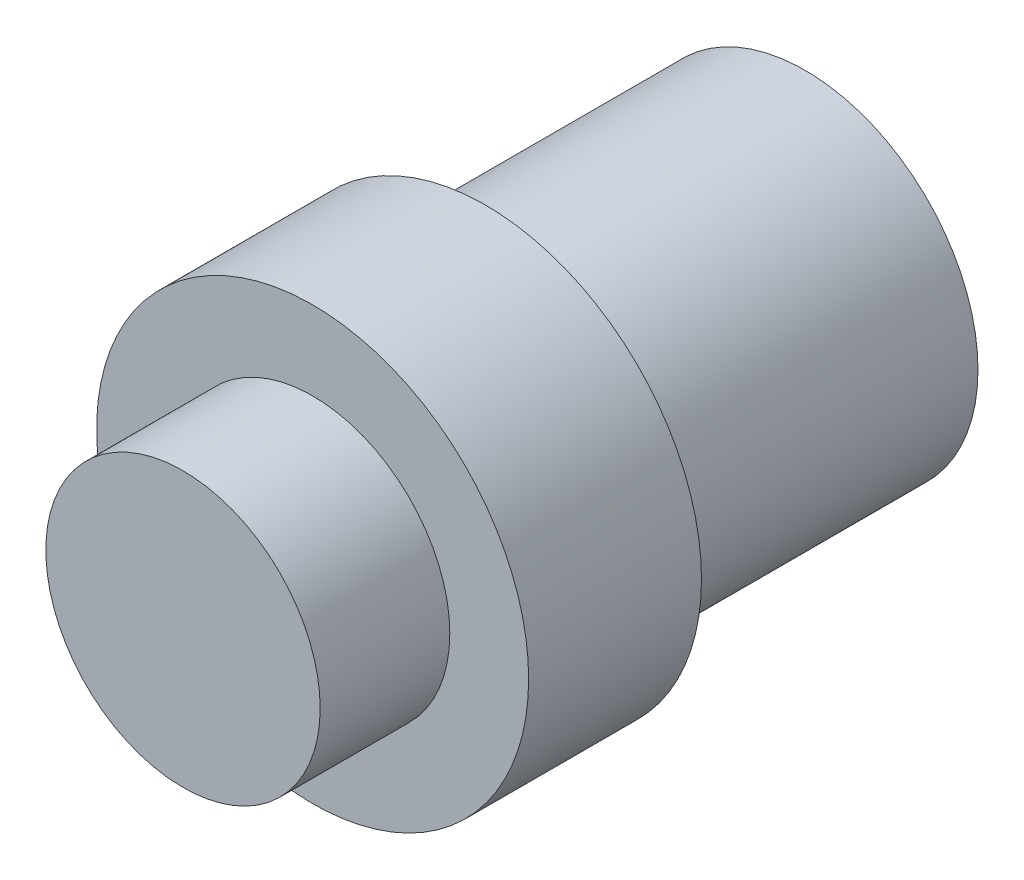
ISO-10303-21;
HEADER;
FILE_DESCRIPTION(('STEP AP214'),'2;1');
FILE_NAME('part.step','',(''),(''),'','','');
FILE_SCHEMA(('AUTOMOTIVE_DESIGN { 1 0 10303 214 1 1 1 1 }'));
ENDSEC;
DATA;
#1=APPLICATION_CONTEXT('core data for automotive mechanical design processes');
#2=APPLICATION_PROTOCOL_DEFINITION('international standard','automotive_design',2000,#1);
#3=PRODUCT_CONTEXT('',#1,'mechanical');
#4=PRODUCT('Part','Part','',(#3));
#5=PRODUCT_RELATED_PRODUCT_CATEGORY('part','',(#4));
#6=PRODUCT_DEFINITION_FORMATION('','',#4);
#7=PRODUCT_DEFINITION_CONTEXT('part definition',#1,'design');
#8=PRODUCT_DEFINITION('design','',#6,#7);
#9=PRODUCT_DEFINITION_SHAPE('','',#8);
#10=(LENGTH_UNIT() NAMED_UNIT(*) SI_UNIT(.MILLI.,.METRE.));
#11=(NAMED_UNIT(*) PLANE_ANGLE_UNIT() SI_UNIT($,.RADIAN.));
#12=(NAMED_UNIT(*) SI_UNIT($,.STERADIAN.) SOLID_ANGLE_UNIT());
#13=UNCERTAINTY_MEASURE_WITH_UNIT(LENGTH_MEASURE(1.E-05),#10,'distance_accuracy_value','');
#14=(GEOMETRIC_REPRESENTATION_CONTEXT(3) GLOBAL_UNCERTAINTY_ASSIGNED_CONTEXT((#13)) GLOBAL_UNIT_ASSIGNED_CONTEXT((#10,
#11,#12)) REPRESENTATION_CONTEXT('',''));
#15=CARTESIAN_POINT('',(0.,0.,0.));
#16=DIRECTION('',(0.,0.,1.));
#17=DIRECTION('',(1.,0.,0.));
#18=AXIS2_PLACEMENT_3D('',#15,#16,#17);
#19=CARTESIAN_POINT('',(0.,0.,18.5));
#20=DIRECTION('',(0.,0.,-1.));
#21=DIRECTION('',(-1.,0.,0.));
#22=AXIS2_PLACEMENT_3D('',#19,#20,#21);
#23=CYLINDRICAL_SURFACE('',#22,20.);
#24=CARTESIAN_POINT('',(0.,0.,18.5));
#25=DIRECTION('',(0.,0.,1.));
#26=DIRECTION('',(1.,0.,0.));
#27=AXIS2_PLACEMENT_3D('',#24,#25,#26);
#28=CIRCLE('',#27,20.);
#29=CARTESIAN_POINT('',(20.,0.,18.5));
#30=VERTEX_POINT('',#29);
#31=EDGE_CURVE('E38',#30,#30,#28,.T.);
#32=ORIENTED_EDGE('',*,*,#31,.F.);
#33=EDGE_LOOP('',(#32));
#34=FACE_BOUND('',#33,.T.);
#35=CARTESIAN_POINT('',(0.,0.,-18.5));
#36=DIRECTION('',(0.,0.,1.));
#37=DIRECTION('',(1.,0.,0.));
#38=AXIS2_PLACEMENT_3D('',#35,#36,#37);
#39=CIRCLE('',#38,20.);
#40=CARTESIAN_POINT('',(20.,0.,-18.5));
#41=VERTEX_POINT('',#40);
#42=EDGE_CURVE('E34',#41,#41,#39,.T.);
#43=ORIENTED_EDGE('',*,*,#42,.T.);
#44=EDGE_LOOP('',(#43));
#45=FACE_BOUND('',#44,.T.);
#46=ADVANCED_FACE('F31',(#34,#45),#23,.T.);
#47=CARTESIAN_POINT('',(0.,0.,-18.5));
#48=DIRECTION('',(0.,0.,1.));
#49=DIRECTION('',(1.,0.,0.));
#50=AXIS2_PLACEMENT_3D('',#47,#48,#49);
#51=PLANE('',#50);
#52=ORIENTED_EDGE('',*,*,#42,.F.);
#53=EDGE_LOOP('',(#52));
#54=FACE_BOUND('',#53,.T.);
#55=ADVANCED_FACE('F72',(#54),#51,.F.);
#56=CARTESIAN_POINT('',(0.,0.,38.5));
#57=DIRECTION('',(0.,0.,-1.));
#58=DIRECTION('',(-1.,0.,0.));
#59=AXIS2_PLACEMENT_3D('',#56,#57,#58);
#60=CYLINDRICAL_SURFACE('',#59,25.);
#61=CARTESIAN_POINT('',(0.,0.,38.5));
#62=DIRECTION('',(0.,0.,1.));
#63=DIRECTION('',(1.,0.,0.));
#64=AXIS2_PLACEMENT_3D('',#61,#62,#63);
#65=CIRCLE('',#64,25.);
#66=CARTESIAN_POINT('',(25.,0.,38.5));
#67=VERTEX_POINT('',#66);
#68=EDGE_CURVE('E46',#67,#67,#65,.T.);
#69=ORIENTED_EDGE('',*,*,#68,.F.);
#70=EDGE_LOOP('',(#69));
#71=FACE_BOUND('',#70,.T.);
#72=CARTESIAN_POINT('',(0.,0.,18.5));
#73=DIRECTION('',(0.,0.,1.));
#74=DIRECTION('',(1.,0.,0.));
#75=AXIS2_PLACEMENT_3D('',#72,#73,#74);
#76=CIRCLE('',#75,25.);
#77=CARTESIAN_POINT('',(25.,0.,18.5));
#78=VERTEX_POINT('',#77);
#79=EDGE_CURVE('E49',#78,#78,#76,.T.);
#80=ORIENTED_EDGE('',*,*,#79,.T.);
#81=EDGE_LOOP('',(#80));
#82=FACE_BOUND('',#81,.T.);
#83=ADVANCED_FACE('F77',(#71,#82),#60,.T.);
#84=CARTESIAN_POINT('',(0.,0.,38.5));
#85=DIRECTION('',(0.,0.,1.));
#86=DIRECTION('',(1.,0.,0.));
#87=AXIS2_PLACEMENT_3D('',#84,#85,#86);
#88=PLANE('',#87);
#89=CARTESIAN_POINT('',(0.,0.,38.5));
#90=DIRECTION('',(0.,0.,1.));
#91=DIRECTION('',(1.,0.,0.));
#92=AXIS2_PLACEMENT_3D('',#89,#90,#91);
#93=CIRCLE('',#92,15.875);
#94=CARTESIAN_POINT('',(15.875,0.,38.5));
#95=VERTEX_POINT('',#94);
#96=EDGE_CURVE('E10',#95,#95,#93,.T.);
#97=ORIENTED_EDGE('',*,*,#96,.F.);
#98=EDGE_LOOP('',(#97));
#99=FACE_BOUND('',#98,.T.);
#100=ORIENTED_EDGE('',*,*,#68,.T.);
#101=EDGE_LOOP('',(#100));
#102=FACE_BOUND('',#101,.T.);
#103=ADVANCED_FACE('F67',(#99,#102),#88,.T.);
#104=CARTESIAN_POINT('',(0.,0.,18.5));
#105=DIRECTION('',(0.,0.,1.));
#106=DIRECTION('',(1.,0.,0.));
#107=AXIS2_PLACEMENT_3D('',#104,#105,#106);
#108=PLANE('',#107);
#109=ORIENTED_EDGE('',*,*,#31,.T.);
#110=EDGE_LOOP('',(#109));
#111=FACE_BOUND('',#110,.T.);
#112=ORIENTED_EDGE('',*,*,#79,.F.);
#113=EDGE_LOOP('',(#112));
#114=FACE_BOUND('',#113,.T.);
#115=ADVANCED_FACE('F60',(#111,#114),#108,.F.);
#116=CARTESIAN_POINT('',(0.,0.,53.5));
#117=DIRECTION('',(0.,0.,-1.));
#118=DIRECTION('',(-1.,0.,0.));
#119=AXIS2_PLACEMENT_3D('',#116,#117,#118);
#120=CYLINDRICAL_SURFACE('',#119,15.875);
#121=CARTESIAN_POINT('',(0.,0.,53.5));
#122=DIRECTION('',(0.,0.,1.));
#123=DIRECTION('',(1.,0.,0.));
#124=AXIS2_PLACEMENT_3D('',#121,#122,#123);
#125=CIRCLE('',#124,15.875);
#126=CARTESIAN_POINT('',(15.875,0.,53.5));
#127=VERTEX_POINT('',#126);
#128=EDGE_CURVE('E45',#127,#127,#125,.T.);
#129=ORIENTED_EDGE('',*,*,#128,.F.);
#130=EDGE_LOOP('',(#129));
#131=FACE_BOUND('',#130,.T.);
#132=ORIENTED_EDGE('',*,*,#96,.T.);
#133=EDGE_LOOP('',(#132));
#134=FACE_BOUND('',#133,.T.);
#135=ADVANCED_FACE('F58',(#131,#134),#120,.T.);
#136=CARTESIAN_POINT('',(0.,0.,53.5));
#137=DIRECTION('',(0.,0.,1.));
#138=DIRECTION('',(1.,0.,0.));
#139=AXIS2_PLACEMENT_3D('',#136,#137,#138);
#140=PLANE('',#139);
#141=ORIENTED_EDGE('',*,*,#128,.T.);
#142=EDGE_LOOP('',(#141));
#143=FACE_BOUND('',#142,.T.);
#144=ADVANCED_FACE('F56',(#143),#140,.T.);
#145=CLOSED_SHELL('',(#46,#55,#83,#103,#115,#135,#144));
#146=MANIFOLD_SOLID_BREP('B2',#145);
#147=ADVANCED_BREP_SHAPE_REPRESENTATION('',(#18,#146),#14);
#148=SHAPE_DEFINITION_REPRESENTATION(#9,#147);
ENDSEC;
END-ISO-10303-21;
